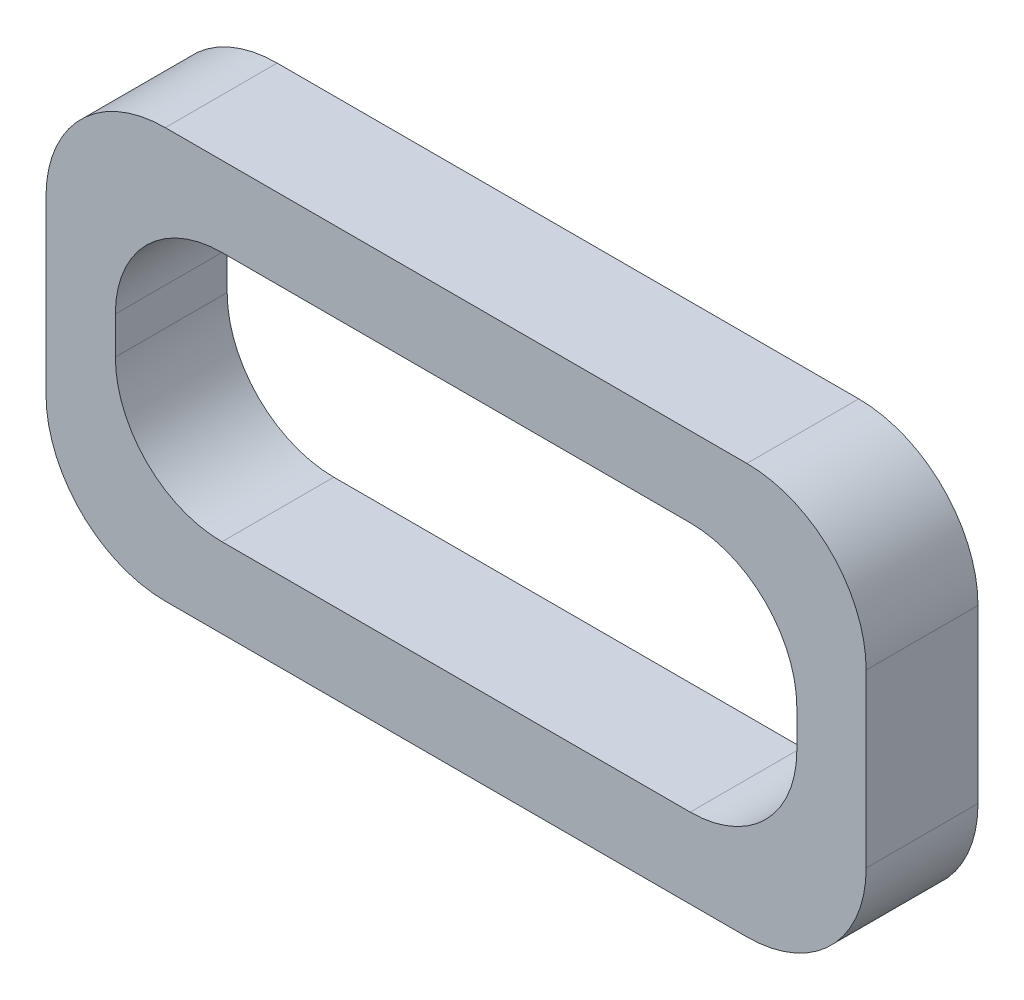
ISO-10303-21;
HEADER;
FILE_DESCRIPTION(('STEP AP214'),'2;1');
FILE_NAME('part.step','',(''),(''),'','','');
FILE_SCHEMA(('AUTOMOTIVE_DESIGN { 1 0 10303 214 1 1 1 1 }'));
ENDSEC;
DATA;
#1=APPLICATION_CONTEXT('core data for automotive mechanical design processes');
#2=APPLICATION_PROTOCOL_DEFINITION('international standard','automotive_design',2000,#1);
#3=PRODUCT_CONTEXT('',#1,'mechanical');
#4=PRODUCT('Part','Part','',(#3));
#5=PRODUCT_RELATED_PRODUCT_CATEGORY('part','',(#4));
#6=PRODUCT_DEFINITION_FORMATION('','',#4);
#7=PRODUCT_DEFINITION_CONTEXT('part definition',#1,'design');
#8=PRODUCT_DEFINITION('design','',#6,#7);
#9=PRODUCT_DEFINITION_SHAPE('','',#8);
#10=(LENGTH_UNIT() NAMED_UNIT(*) SI_UNIT(.MILLI.,.METRE.));
#11=(NAMED_UNIT(*) PLANE_ANGLE_UNIT() SI_UNIT($,.RADIAN.));
#12=(NAMED_UNIT(*) SI_UNIT($,.STERADIAN.) SOLID_ANGLE_UNIT());
#13=UNCERTAINTY_MEASURE_WITH_UNIT(LENGTH_MEASURE(1.E-05),#10,'distance_accuracy_value','');
#14=(GEOMETRIC_REPRESENTATION_CONTEXT(3) GLOBAL_UNCERTAINTY_ASSIGNED_CONTEXT((#13)) GLOBAL_UNIT_ASSIGNED_CONTEXT((#10,
#11,#12)) REPRESENTATION_CONTEXT('',''));
#15=CARTESIAN_POINT('',(0.,0.,0.));
#16=DIRECTION('',(0.,0.,1.));
#17=DIRECTION('',(1.,0.,0.));
#18=AXIS2_PLACEMENT_3D('',#15,#16,#17);
#19=CARTESIAN_POINT('',(-3.9,-1.15,1.5));
#20=DIRECTION('',(0.,0.,1.));
#21=DIRECTION('',(1.,0.,0.));
#22=AXIS2_PLACEMENT_3D('',#19,#20,#21);
#23=PLANE('',#22);
#24=CARTESIAN_POINT('',(-3.9,-1.15,1.5));
#25=DIRECTION('',(0.,0.,1.));
#26=DIRECTION('',(1.,0.,0.));
#27=AXIS2_PLACEMENT_3D('',#24,#25,#26);
#28=CIRCLE('',#27,1.6);
#29=CARTESIAN_POINT('',(-5.5,-1.15,1.5));
#30=VERTEX_POINT('',#29);
#31=CARTESIAN_POINT('',(-3.9,-2.75,1.5));
#32=VERTEX_POINT('',#31);
#33=EDGE_CURVE('E217',#30,#32,#28,.T.);
#34=ORIENTED_EDGE('',*,*,#33,.T.);
#35=DIRECTION('',(1.,0.,0.));
#36=VECTOR('',#35,1.);
#37=CARTESIAN_POINT('',(-3.9,-2.75,1.5));
#38=LINE('',#37,#36);
#39=CARTESIAN_POINT('',(3.9,-2.75,1.5));
#40=VERTEX_POINT('',#39);
#41=EDGE_CURVE('E220',#32,#40,#38,.T.);
#42=ORIENTED_EDGE('',*,*,#41,.T.);
#43=CARTESIAN_POINT('',(3.9,-1.15,1.5));
#44=DIRECTION('',(0.,0.,1.));
#45=DIRECTION('',(1.,0.,0.));
#46=AXIS2_PLACEMENT_3D('',#43,#44,#45);
#47=CIRCLE('',#46,1.6);
#48=CARTESIAN_POINT('',(5.5,-1.15,1.5));
#49=VERTEX_POINT('',#48);
#50=EDGE_CURVE('E223',#40,#49,#47,.T.);
#51=ORIENTED_EDGE('',*,*,#50,.T.);
#52=DIRECTION('',(0.,1.,0.));
#53=VECTOR('',#52,1.);
#54=CARTESIAN_POINT('',(5.5,-1.15,1.5));
#55=LINE('',#54,#53);
#56=CARTESIAN_POINT('',(5.5,1.15,1.5));
#57=VERTEX_POINT('',#56);
#58=EDGE_CURVE('E225',#49,#57,#55,.T.);
#59=ORIENTED_EDGE('',*,*,#58,.T.);
#60=CARTESIAN_POINT('',(3.9,1.15,1.5));
#61=DIRECTION('',(0.,0.,1.));
#62=DIRECTION('',(1.,0.,0.));
#63=AXIS2_PLACEMENT_3D('',#60,#61,#62);
#64=CIRCLE('',#63,1.6);
#65=CARTESIAN_POINT('',(3.9,2.75,1.5));
#66=VERTEX_POINT('',#65);
#67=EDGE_CURVE('E227',#57,#66,#64,.T.);
#68=ORIENTED_EDGE('',*,*,#67,.T.);
#69=DIRECTION('',(-1.,0.,0.));
#70=VECTOR('',#69,1.);
#71=CARTESIAN_POINT('',(3.9,2.75,1.5));
#72=LINE('',#71,#70);
#73=CARTESIAN_POINT('',(-3.9,2.75,1.5));
#74=VERTEX_POINT('',#73);
#75=EDGE_CURVE('E229',#66,#74,#72,.T.);
#76=ORIENTED_EDGE('',*,*,#75,.T.);
#77=CARTESIAN_POINT('',(-3.9,1.15,1.5));
#78=DIRECTION('',(0.,0.,1.));
#79=DIRECTION('',(1.,0.,0.));
#80=AXIS2_PLACEMENT_3D('',#77,#78,#79);
#81=CIRCLE('',#80,1.6);
#82=CARTESIAN_POINT('',(-5.5,1.15,1.5));
#83=VERTEX_POINT('',#82);
#84=EDGE_CURVE('E231',#74,#83,#81,.T.);
#85=ORIENTED_EDGE('',*,*,#84,.T.);
#86=DIRECTION('',(0.,-1.,0.));
#87=VECTOR('',#86,1.);
#88=CARTESIAN_POINT('',(-5.5,1.15,1.5));
#89=LINE('',#88,#87);
#90=EDGE_CURVE('E233',#83,#30,#89,.T.);
#91=ORIENTED_EDGE('',*,*,#90,.T.);
#92=EDGE_LOOP('',(#34,#42,#51,#59,#68,#76,#85,#91));
#93=FACE_BOUND('',#92,.T.);
#94=DIRECTION('',(0.,1.,0.));
#95=VECTOR('',#94,1.);
#96=CARTESIAN_POINT('',(4.57,-0.250000000000001,1.5));
#97=LINE('',#96,#95);
#98=CARTESIAN_POINT('',(4.57,-0.250000000000001,1.5));
#99=VERTEX_POINT('',#98);
#100=CARTESIAN_POINT('',(4.57,0.250000000000001,1.5));
#101=VERTEX_POINT('',#100);
#102=EDGE_CURVE('E160',#99,#101,#97,.T.);
#103=ORIENTED_EDGE('',*,*,#102,.F.);
#104=CARTESIAN_POINT('',(3.14,-0.250000000000001,1.5));
#105=DIRECTION('',(0.,0.,1.));
#106=DIRECTION('',(1.,0.,0.));
#107=AXIS2_PLACEMENT_3D('',#104,#105,#106);
#108=CIRCLE('',#107,1.43);
#109=CARTESIAN_POINT('',(3.14,-1.68,1.5));
#110=VERTEX_POINT('',#109);
#111=EDGE_CURVE('E152',#110,#99,#108,.T.);
#112=ORIENTED_EDGE('',*,*,#111,.F.);
#113=DIRECTION('',(1.,0.,0.));
#114=VECTOR('',#113,1.);
#115=CARTESIAN_POINT('',(-3.14,-1.68,1.5));
#116=LINE('',#115,#114);
#117=CARTESIAN_POINT('',(-3.14,-1.68,1.5));
#118=VERTEX_POINT('',#117);
#119=EDGE_CURVE('E185',#118,#110,#116,.T.);
#120=ORIENTED_EDGE('',*,*,#119,.F.);
#121=CARTESIAN_POINT('',(-3.14,-0.25,1.5));
#122=DIRECTION('',(0.,0.,1.));
#123=DIRECTION('',(1.,0.,0.));
#124=AXIS2_PLACEMENT_3D('',#121,#122,#123);
#125=CIRCLE('',#124,1.43);
#126=CARTESIAN_POINT('',(-4.57,-0.249999999999996,1.5));
#127=VERTEX_POINT('',#126);
#128=EDGE_CURVE('E183',#127,#118,#125,.T.);
#129=ORIENTED_EDGE('',*,*,#128,.F.);
#130=DIRECTION('',(0.,-1.,0.));
#131=VECTOR('',#130,1.);
#132=CARTESIAN_POINT('',(-4.57,0.250000000000004,1.5));
#133=LINE('',#132,#131);
#134=CARTESIAN_POINT('',(-4.57,0.250000000000004,1.5));
#135=VERTEX_POINT('',#134);
#136=EDGE_CURVE('E181',#135,#127,#133,.T.);
#137=ORIENTED_EDGE('',*,*,#136,.F.);
#138=CARTESIAN_POINT('',(-3.14,0.250000000000001,1.5));
#139=DIRECTION('',(0.,0.,1.));
#140=DIRECTION('',(1.,0.,0.));
#141=AXIS2_PLACEMENT_3D('',#138,#139,#140);
#142=CIRCLE('',#141,1.43);
#143=CARTESIAN_POINT('',(-3.14,1.68,1.5));
#144=VERTEX_POINT('',#143);
#145=EDGE_CURVE('E179',#144,#135,#142,.T.);
#146=ORIENTED_EDGE('',*,*,#145,.F.);
#147=DIRECTION('',(-1.,0.,0.));
#148=VECTOR('',#147,1.);
#149=CARTESIAN_POINT('',(3.14,1.68,1.5));
#150=LINE('',#149,#148);
#151=CARTESIAN_POINT('',(3.14,1.68,1.5));
#152=VERTEX_POINT('',#151);
#153=EDGE_CURVE('E175',#152,#144,#150,.T.);
#154=ORIENTED_EDGE('',*,*,#153,.F.);
#155=CARTESIAN_POINT('',(3.14,0.25,1.5));
#156=DIRECTION('',(0.,0.,1.));
#157=DIRECTION('',(1.,0.,0.));
#158=AXIS2_PLACEMENT_3D('',#155,#156,#157);
#159=CIRCLE('',#158,1.43);
#160=EDGE_CURVE('E173',#101,#152,#159,.T.);
#161=ORIENTED_EDGE('',*,*,#160,.F.);
#162=EDGE_LOOP('',(#103,#112,#120,#129,#137,#146,#154,#161));
#163=FACE_BOUND('',#162,.T.);
#164=ADVANCED_FACE('F39',(#93,#163),#23,.T.);
#165=CARTESIAN_POINT('',(-3.9,-1.15,0.));
#166=DIRECTION('',(0.,0.,1.));
#167=DIRECTION('',(1.,0.,0.));
#168=AXIS2_PLACEMENT_3D('',#165,#166,#167);
#169=PLANE('',#168);
#170=CARTESIAN_POINT('',(-3.9,-1.15,0.));
#171=DIRECTION('',(0.,0.,1.));
#172=DIRECTION('',(1.,0.,0.));
#173=AXIS2_PLACEMENT_3D('',#170,#171,#172);
#174=CIRCLE('',#173,1.6);
#175=CARTESIAN_POINT('',(-5.5,-1.15,0.));
#176=VERTEX_POINT('',#175);
#177=CARTESIAN_POINT('',(-3.9,-2.75,0.));
#178=VERTEX_POINT('',#177);
#179=EDGE_CURVE('E168',#176,#178,#174,.T.);
#180=ORIENTED_EDGE('',*,*,#179,.F.);
#181=DIRECTION('',(0.,-1.,0.));
#182=VECTOR('',#181,1.);
#183=CARTESIAN_POINT('',(-5.5,1.15,0.));
#184=LINE('',#183,#182);
#185=CARTESIAN_POINT('',(-5.5,1.15,0.));
#186=VERTEX_POINT('',#185);
#187=EDGE_CURVE('E221',#186,#176,#184,.T.);
#188=ORIENTED_EDGE('',*,*,#187,.F.);
#189=CARTESIAN_POINT('',(-3.9,1.15,0.));
#190=DIRECTION('',(0.,0.,1.));
#191=DIRECTION('',(1.,0.,0.));
#192=AXIS2_PLACEMENT_3D('',#189,#190,#191);
#193=CIRCLE('',#192,1.6);
#194=CARTESIAN_POINT('',(-3.9,2.75,0.));
#195=VERTEX_POINT('',#194);
#196=EDGE_CURVE('E248',#195,#186,#193,.T.);
#197=ORIENTED_EDGE('',*,*,#196,.F.);
#198=DIRECTION('',(-1.,0.,0.));
#199=VECTOR('',#198,1.);
#200=CARTESIAN_POINT('',(3.9,2.75,0.));
#201=LINE('',#200,#199);
#202=CARTESIAN_POINT('',(3.9,2.75,0.));
#203=VERTEX_POINT('',#202);
#204=EDGE_CURVE('E246',#203,#195,#201,.T.);
#205=ORIENTED_EDGE('',*,*,#204,.F.);
#206=CARTESIAN_POINT('',(3.9,1.15,0.));
#207=DIRECTION('',(0.,0.,1.));
#208=DIRECTION('',(1.,0.,0.));
#209=AXIS2_PLACEMENT_3D('',#206,#207,#208);
#210=CIRCLE('',#209,1.6);
#211=CARTESIAN_POINT('',(5.5,1.15,0.));
#212=VERTEX_POINT('',#211);
#213=EDGE_CURVE('E244',#212,#203,#210,.T.);
#214=ORIENTED_EDGE('',*,*,#213,.F.);
#215=DIRECTION('',(0.,1.,0.));
#216=VECTOR('',#215,1.);
#217=CARTESIAN_POINT('',(5.5,-1.15,0.));
#218=LINE('',#217,#216);
#219=CARTESIAN_POINT('',(5.5,-1.15,0.));
#220=VERTEX_POINT('',#219);
#221=EDGE_CURVE('E242',#220,#212,#218,.T.);
#222=ORIENTED_EDGE('',*,*,#221,.F.);
#223=CARTESIAN_POINT('',(3.9,-1.15,0.));
#224=DIRECTION('',(0.,0.,1.));
#225=DIRECTION('',(1.,0.,0.));
#226=AXIS2_PLACEMENT_3D('',#223,#224,#225);
#227=CIRCLE('',#226,1.6);
#228=CARTESIAN_POINT('',(3.9,-2.75,0.));
#229=VERTEX_POINT('',#228);
#230=EDGE_CURVE('E240',#229,#220,#227,.T.);
#231=ORIENTED_EDGE('',*,*,#230,.F.);
#232=DIRECTION('',(1.,0.,0.));
#233=VECTOR('',#232,1.);
#234=CARTESIAN_POINT('',(-3.9,-2.75,0.));
#235=LINE('',#234,#233);
#236=EDGE_CURVE('E238',#178,#229,#235,.T.);
#237=ORIENTED_EDGE('',*,*,#236,.F.);
#238=EDGE_LOOP('',(#180,#188,#197,#205,#214,#222,#231,#237));
#239=FACE_BOUND('',#238,.T.);
#240=CARTESIAN_POINT('',(3.14,-0.250000000000001,0.));
#241=DIRECTION('',(0.,0.,1.));
#242=DIRECTION('',(1.,0.,0.));
#243=AXIS2_PLACEMENT_3D('',#240,#241,#242);
#244=CIRCLE('',#243,1.43);
#245=CARTESIAN_POINT('',(3.14,-1.68,0.));
#246=VERTEX_POINT('',#245);
#247=CARTESIAN_POINT('',(4.57,-0.250000000000001,0.));
#248=VERTEX_POINT('',#247);
#249=EDGE_CURVE('E62',#246,#248,#244,.T.);
#250=ORIENTED_EDGE('',*,*,#249,.T.);
#251=DIRECTION('',(0.,1.,0.));
#252=VECTOR('',#251,1.);
#253=CARTESIAN_POINT('',(4.57,-0.250000000000001,0.));
#254=LINE('',#253,#252);
#255=CARTESIAN_POINT('',(4.57,0.250000000000001,0.));
#256=VERTEX_POINT('',#255);
#257=EDGE_CURVE('E167',#248,#256,#254,.T.);
#258=ORIENTED_EDGE('',*,*,#257,.T.);
#259=CARTESIAN_POINT('',(3.14,0.25,0.));
#260=DIRECTION('',(0.,0.,1.));
#261=DIRECTION('',(1.,0.,0.));
#262=AXIS2_PLACEMENT_3D('',#259,#260,#261);
#263=CIRCLE('',#262,1.43);
#264=CARTESIAN_POINT('',(3.14,1.68,0.));
#265=VERTEX_POINT('',#264);
#266=EDGE_CURVE('E189',#256,#265,#263,.T.);
#267=ORIENTED_EDGE('',*,*,#266,.T.);
#268=DIRECTION('',(-1.,0.,0.));
#269=VECTOR('',#268,1.);
#270=CARTESIAN_POINT('',(3.14,1.68,0.));
#271=LINE('',#270,#269);
#272=CARTESIAN_POINT('',(-3.14,1.68,0.));
#273=VERTEX_POINT('',#272);
#274=EDGE_CURVE('E192',#265,#273,#271,.T.);
#275=ORIENTED_EDGE('',*,*,#274,.T.);
#276=CARTESIAN_POINT('',(-3.14,0.250000000000001,0.));
#277=DIRECTION('',(0.,0.,1.));
#278=DIRECTION('',(1.,0.,0.));
#279=AXIS2_PLACEMENT_3D('',#276,#277,#278);
#280=CIRCLE('',#279,1.43);
#281=CARTESIAN_POINT('',(-4.57,0.250000000000004,0.));
#282=VERTEX_POINT('',#281);
#283=EDGE_CURVE('E195',#273,#282,#280,.T.);
#284=ORIENTED_EDGE('',*,*,#283,.T.);
#285=DIRECTION('',(0.,-1.,0.));
#286=VECTOR('',#285,1.);
#287=CARTESIAN_POINT('',(-4.57,0.250000000000004,0.));
#288=LINE('',#287,#286);
#289=CARTESIAN_POINT('',(-4.57,-0.249999999999996,0.));
#290=VERTEX_POINT('',#289);
#291=EDGE_CURVE('E198',#282,#290,#288,.T.);
#292=ORIENTED_EDGE('',*,*,#291,.T.);
#293=CARTESIAN_POINT('',(-3.14,-0.25,0.));
#294=DIRECTION('',(0.,0.,1.));
#295=DIRECTION('',(1.,0.,0.));
#296=AXIS2_PLACEMENT_3D('',#293,#294,#295);
#297=CIRCLE('',#296,1.43);
#298=CARTESIAN_POINT('',(-3.14,-1.68,0.));
#299=VERTEX_POINT('',#298);
#300=EDGE_CURVE('E201',#290,#299,#297,.T.);
#301=ORIENTED_EDGE('',*,*,#300,.T.);
#302=DIRECTION('',(1.,0.,0.));
#303=VECTOR('',#302,1.);
#304=CARTESIAN_POINT('',(-3.14,-1.68,0.));
#305=LINE('',#304,#303);
#306=EDGE_CURVE('E161',#299,#246,#305,.T.);
#307=ORIENTED_EDGE('',*,*,#306,.T.);
#308=EDGE_LOOP('',(#250,#258,#267,#275,#284,#292,#301,#307));
#309=FACE_BOUND('',#308,.T.);
#310=ADVANCED_FACE('F278',(#239,#309),#169,.F.);
#311=CARTESIAN_POINT('',(-3.9,-1.15,1.5));
#312=DIRECTION('',(0.,0.,-1.));
#313=DIRECTION('',(-1.,0.,0.));
#314=AXIS2_PLACEMENT_3D('',#311,#312,#313);
#315=CYLINDRICAL_SURFACE('',#314,1.6);
#316=ORIENTED_EDGE('',*,*,#179,.T.);
#317=DIRECTION('',(0.,0.,-1.));
#318=VECTOR('',#317,1.);
#319=CARTESIAN_POINT('',(-3.9,-2.75,1.5));
#320=LINE('',#319,#318);
#321=EDGE_CURVE('E11',#32,#178,#320,.T.);
#322=ORIENTED_EDGE('',*,*,#321,.F.);
#323=ORIENTED_EDGE('',*,*,#33,.F.);
#324=DIRECTION('',(0.,0.,-1.));
#325=VECTOR('',#324,1.);
#326=CARTESIAN_POINT('',(-5.5,-1.15,1.5));
#327=LINE('',#326,#325);
#328=EDGE_CURVE('E235',#30,#176,#327,.T.);
#329=ORIENTED_EDGE('',*,*,#328,.T.);
#330=EDGE_LOOP('',(#316,#322,#323,#329));
#331=FACE_BOUND('',#330,.T.);
#332=ADVANCED_FACE('F41',(#331),#315,.T.);
#333=CARTESIAN_POINT('',(-3.9,-2.75,1.5));
#334=DIRECTION('',(0.,1.,0.));
#335=DIRECTION('',(0.,0.,1.));
#336=AXIS2_PLACEMENT_3D('',#333,#334,#335);
#337=PLANE('',#336);
#338=ORIENTED_EDGE('',*,*,#236,.T.);
#339=DIRECTION('',(0.,0.,-1.));
#340=VECTOR('',#339,1.);
#341=CARTESIAN_POINT('',(3.9,-2.75,1.5));
#342=LINE('',#341,#340);
#343=EDGE_CURVE('E47',#40,#229,#342,.T.);
#344=ORIENTED_EDGE('',*,*,#343,.F.);
#345=ORIENTED_EDGE('',*,*,#41,.F.);
#346=ORIENTED_EDGE('',*,*,#321,.T.);
#347=EDGE_LOOP('',(#338,#344,#345,#346));
#348=FACE_BOUND('',#347,.T.);
#349=ADVANCED_FACE('F295',(#348),#337,.F.);
#350=CARTESIAN_POINT('',(3.9,-1.15,1.5));
#351=DIRECTION('',(0.,0.,-1.));
#352=DIRECTION('',(-1.,0.,0.));
#353=AXIS2_PLACEMENT_3D('',#350,#351,#352);
#354=CYLINDRICAL_SURFACE('',#353,1.6);
#355=ORIENTED_EDGE('',*,*,#230,.T.);
#356=DIRECTION('',(0.,0.,-1.));
#357=VECTOR('',#356,1.);
#358=CARTESIAN_POINT('',(5.5,-1.15,1.5));
#359=LINE('',#358,#357);
#360=EDGE_CURVE('E265',#49,#220,#359,.T.);
#361=ORIENTED_EDGE('',*,*,#360,.F.);
#362=ORIENTED_EDGE('',*,*,#50,.F.);
#363=ORIENTED_EDGE('',*,*,#343,.T.);
#364=EDGE_LOOP('',(#355,#361,#362,#363));
#365=FACE_BOUND('',#364,.T.);
#366=ADVANCED_FACE('F272',(#365),#354,.T.);
#367=CARTESIAN_POINT('',(5.5,-1.15,1.5));
#368=DIRECTION('',(-1.,0.,0.));
#369=DIRECTION('',(0.,0.,1.));
#370=AXIS2_PLACEMENT_3D('',#367,#368,#369);
#371=PLANE('',#370);
#372=ORIENTED_EDGE('',*,*,#221,.T.);
#373=DIRECTION('',(0.,0.,-1.));
#374=VECTOR('',#373,1.);
#375=CARTESIAN_POINT('',(5.5,1.15,1.5));
#376=LINE('',#375,#374);
#377=EDGE_CURVE('E262',#57,#212,#376,.T.);
#378=ORIENTED_EDGE('',*,*,#377,.F.);
#379=ORIENTED_EDGE('',*,*,#58,.F.);
#380=ORIENTED_EDGE('',*,*,#360,.T.);
#381=EDGE_LOOP('',(#372,#378,#379,#380));
#382=FACE_BOUND('',#381,.T.);
#383=ADVANCED_FACE('F284',(#382),#371,.F.);
#384=CARTESIAN_POINT('',(3.9,1.15,1.5));
#385=DIRECTION('',(0.,0.,-1.));
#386=DIRECTION('',(-1.,0.,0.));
#387=AXIS2_PLACEMENT_3D('',#384,#385,#386);
#388=CYLINDRICAL_SURFACE('',#387,1.6);
#389=ORIENTED_EDGE('',*,*,#213,.T.);
#390=DIRECTION('',(0.,0.,-1.));
#391=VECTOR('',#390,1.);
#392=CARTESIAN_POINT('',(3.9,2.75,1.5));
#393=LINE('',#392,#391);
#394=EDGE_CURVE('E259',#66,#203,#393,.T.);
#395=ORIENTED_EDGE('',*,*,#394,.F.);
#396=ORIENTED_EDGE('',*,*,#67,.F.);
#397=ORIENTED_EDGE('',*,*,#377,.T.);
#398=EDGE_LOOP('',(#389,#395,#396,#397));
#399=FACE_BOUND('',#398,.T.);
#400=ADVANCED_FACE('F288',(#399),#388,.T.);
#401=CARTESIAN_POINT('',(3.9,2.75,1.5));
#402=DIRECTION('',(0.,-1.,0.));
#403=DIRECTION('',(1.,0.,0.));
#404=AXIS2_PLACEMENT_3D('',#401,#402,#403);
#405=PLANE('',#404);
#406=ORIENTED_EDGE('',*,*,#204,.T.);
#407=DIRECTION('',(0.,0.,-1.));
#408=VECTOR('',#407,1.);
#409=CARTESIAN_POINT('',(-3.9,2.75,1.5));
#410=LINE('',#409,#408);
#411=EDGE_CURVE('E256',#74,#195,#410,.T.);
#412=ORIENTED_EDGE('',*,*,#411,.F.);
#413=ORIENTED_EDGE('',*,*,#75,.F.);
#414=ORIENTED_EDGE('',*,*,#394,.T.);
#415=EDGE_LOOP('',(#406,#412,#413,#414));
#416=FACE_BOUND('',#415,.T.);
#417=ADVANCED_FACE('F308',(#416),#405,.F.);
#418=CARTESIAN_POINT('',(-3.9,1.15,1.5));
#419=DIRECTION('',(0.,0.,-1.));
#420=DIRECTION('',(-1.,0.,0.));
#421=AXIS2_PLACEMENT_3D('',#418,#419,#420);
#422=CYLINDRICAL_SURFACE('',#421,1.6);
#423=ORIENTED_EDGE('',*,*,#196,.T.);
#424=DIRECTION('',(0.,0.,-1.));
#425=VECTOR('',#424,1.);
#426=CARTESIAN_POINT('',(-5.5,1.15,1.5));
#427=LINE('',#426,#425);
#428=EDGE_CURVE('E253',#83,#186,#427,.T.);
#429=ORIENTED_EDGE('',*,*,#428,.F.);
#430=ORIENTED_EDGE('',*,*,#84,.F.);
#431=ORIENTED_EDGE('',*,*,#411,.T.);
#432=EDGE_LOOP('',(#423,#429,#430,#431));
#433=FACE_BOUND('',#432,.T.);
#434=ADVANCED_FACE('F306',(#433),#422,.T.);
#435=CARTESIAN_POINT('',(-5.5,1.15,1.5));
#436=DIRECTION('',(1.,0.,0.));
#437=DIRECTION('',(0.,1.,0.));
#438=AXIS2_PLACEMENT_3D('',#435,#436,#437);
#439=PLANE('',#438);
#440=ORIENTED_EDGE('',*,*,#187,.T.);
#441=ORIENTED_EDGE('',*,*,#328,.F.);
#442=ORIENTED_EDGE('',*,*,#90,.F.);
#443=ORIENTED_EDGE('',*,*,#428,.T.);
#444=EDGE_LOOP('',(#440,#441,#442,#443));
#445=FACE_BOUND('',#444,.T.);
#446=ADVANCED_FACE('F301',(#445),#439,.F.);
#447=CARTESIAN_POINT('',(3.14,-0.250000000000001,1.5));
#448=DIRECTION('',(0.,0.,-1.));
#449=DIRECTION('',(-1.,0.,0.));
#450=AXIS2_PLACEMENT_3D('',#447,#448,#449);
#451=CYLINDRICAL_SURFACE('',#450,1.43);
#452=ORIENTED_EDGE('',*,*,#249,.F.);
#453=DIRECTION('',(0.,0.,-1.));
#454=VECTOR('',#453,1.);
#455=CARTESIAN_POINT('',(3.14,-1.68,1.5));
#456=LINE('',#455,#454);
#457=EDGE_CURVE('E156',#110,#246,#456,.T.);
#458=ORIENTED_EDGE('',*,*,#457,.F.);
#459=ORIENTED_EDGE('',*,*,#111,.T.);
#460=DIRECTION('',(0.,0.,-1.));
#461=VECTOR('',#460,1.);
#462=CARTESIAN_POINT('',(4.57,-0.250000000000001,1.5));
#463=LINE('',#462,#461);
#464=EDGE_CURVE('E155',#99,#248,#463,.T.);
#465=ORIENTED_EDGE('',*,*,#464,.T.);
#466=EDGE_LOOP('',(#452,#458,#459,#465));
#467=FACE_BOUND('',#466,.T.);
#468=ADVANCED_FACE('F154',(#467),#451,.F.);
#469=CARTESIAN_POINT('',(4.57,-0.250000000000001,1.5));
#470=DIRECTION('',(-1.,0.,0.));
#471=DIRECTION('',(0.,0.,1.));
#472=AXIS2_PLACEMENT_3D('',#469,#470,#471);
#473=PLANE('',#472);
#474=ORIENTED_EDGE('',*,*,#257,.F.);
#475=ORIENTED_EDGE('',*,*,#464,.F.);
#476=ORIENTED_EDGE('',*,*,#102,.T.);
#477=DIRECTION('',(0.,0.,-1.));
#478=VECTOR('',#477,1.);
#479=CARTESIAN_POINT('',(4.57,0.250000000000001,1.5));
#480=LINE('',#479,#478);
#481=EDGE_CURVE('E169',#101,#256,#480,.T.);
#482=ORIENTED_EDGE('',*,*,#481,.T.);
#483=EDGE_LOOP('',(#474,#475,#476,#482));
#484=FACE_BOUND('',#483,.T.);
#485=ADVANCED_FACE('F164',(#484),#473,.T.);
#486=CARTESIAN_POINT('',(3.14,0.25,1.5));
#487=DIRECTION('',(0.,0.,-1.));
#488=DIRECTION('',(-1.,0.,0.));
#489=AXIS2_PLACEMENT_3D('',#486,#487,#488);
#490=CYLINDRICAL_SURFACE('',#489,1.43);
#491=ORIENTED_EDGE('',*,*,#266,.F.);
#492=ORIENTED_EDGE('',*,*,#481,.F.);
#493=ORIENTED_EDGE('',*,*,#160,.T.);
#494=DIRECTION('',(0.,0.,-1.));
#495=VECTOR('',#494,1.);
#496=CARTESIAN_POINT('',(3.14,1.68,1.5));
#497=LINE('',#496,#495);
#498=EDGE_CURVE('E214',#152,#265,#497,.T.);
#499=ORIENTED_EDGE('',*,*,#498,.T.);
#500=EDGE_LOOP('',(#491,#492,#493,#499));
#501=FACE_BOUND('',#500,.T.);
#502=ADVANCED_FACE('F333',(#501),#490,.F.);
#503=CARTESIAN_POINT('',(3.14,1.68,1.5));
#504=DIRECTION('',(0.,-1.,0.));
#505=DIRECTION('',(0.,0.,-1.));
#506=AXIS2_PLACEMENT_3D('',#503,#504,#505);
#507=PLANE('',#506);
#508=ORIENTED_EDGE('',*,*,#274,.F.);
#509=ORIENTED_EDGE('',*,*,#498,.F.);
#510=ORIENTED_EDGE('',*,*,#153,.T.);
#511=DIRECTION('',(0.,0.,-1.));
#512=VECTOR('',#511,1.);
#513=CARTESIAN_POINT('',(-3.14,1.68,1.5));
#514=LINE('',#513,#512);
#515=EDGE_CURVE('E212',#144,#273,#514,.T.);
#516=ORIENTED_EDGE('',*,*,#515,.T.);
#517=EDGE_LOOP('',(#508,#509,#510,#516));
#518=FACE_BOUND('',#517,.T.);
#519=ADVANCED_FACE('F337',(#518),#507,.T.);
#520=CARTESIAN_POINT('',(-3.14,0.250000000000001,1.5));
#521=DIRECTION('',(0.,0.,-1.));
#522=DIRECTION('',(-1.,0.,0.));
#523=AXIS2_PLACEMENT_3D('',#520,#521,#522);
#524=CYLINDRICAL_SURFACE('',#523,1.43);
#525=ORIENTED_EDGE('',*,*,#283,.F.);
#526=ORIENTED_EDGE('',*,*,#515,.F.);
#527=ORIENTED_EDGE('',*,*,#145,.T.);
#528=DIRECTION('',(0.,0.,-1.));
#529=VECTOR('',#528,1.);
#530=CARTESIAN_POINT('',(-4.57,0.250000000000004,1.5));
#531=LINE('',#530,#529);
#532=EDGE_CURVE('E210',#135,#282,#531,.T.);
#533=ORIENTED_EDGE('',*,*,#532,.T.);
#534=EDGE_LOOP('',(#525,#526,#527,#533));
#535=FACE_BOUND('',#534,.T.);
#536=ADVANCED_FACE('F343',(#535),#524,.F.);
#537=CARTESIAN_POINT('',(-4.57,0.250000000000004,1.5));
#538=DIRECTION('',(1.,0.,0.));
#539=DIRECTION('',(0.,1.,0.));
#540=AXIS2_PLACEMENT_3D('',#537,#538,#539);
#541=PLANE('',#540);
#542=ORIENTED_EDGE('',*,*,#291,.F.);
#543=ORIENTED_EDGE('',*,*,#532,.F.);
#544=ORIENTED_EDGE('',*,*,#136,.T.);
#545=DIRECTION('',(0.,0.,-1.));
#546=VECTOR('',#545,1.);
#547=CARTESIAN_POINT('',(-4.57,-0.249999999999996,1.5));
#548=LINE('',#547,#546);
#549=EDGE_CURVE('E208',#127,#290,#548,.T.);
#550=ORIENTED_EDGE('',*,*,#549,.T.);
#551=EDGE_LOOP('',(#542,#543,#544,#550));
#552=FACE_BOUND('',#551,.T.);
#553=ADVANCED_FACE('F347',(#552),#541,.T.);
#554=CARTESIAN_POINT('',(-3.14,-0.25,1.5));
#555=DIRECTION('',(0.,0.,-1.));
#556=DIRECTION('',(-1.,0.,0.));
#557=AXIS2_PLACEMENT_3D('',#554,#555,#556);
#558=CYLINDRICAL_SURFACE('',#557,1.43);
#559=ORIENTED_EDGE('',*,*,#300,.F.);
#560=ORIENTED_EDGE('',*,*,#549,.F.);
#561=ORIENTED_EDGE('',*,*,#128,.T.);
#562=DIRECTION('',(0.,0.,-1.));
#563=VECTOR('',#562,1.);
#564=CARTESIAN_POINT('',(-3.14,-1.68,1.5));
#565=LINE('',#564,#563);
#566=EDGE_CURVE('E54',#118,#299,#565,.T.);
#567=ORIENTED_EDGE('',*,*,#566,.T.);
#568=EDGE_LOOP('',(#559,#560,#561,#567));
#569=FACE_BOUND('',#568,.T.);
#570=ADVANCED_FACE('F351',(#569),#558,.F.);
#571=CARTESIAN_POINT('',(-3.14,-1.68,1.5));
#572=DIRECTION('',(0.,1.,0.));
#573=DIRECTION('',(-1.,0.,0.));
#574=AXIS2_PLACEMENT_3D('',#571,#572,#573);
#575=PLANE('',#574);
#576=ORIENTED_EDGE('',*,*,#306,.F.);
#577=ORIENTED_EDGE('',*,*,#566,.F.);
#578=ORIENTED_EDGE('',*,*,#119,.T.);
#579=ORIENTED_EDGE('',*,*,#457,.T.);
#580=EDGE_LOOP('',(#576,#577,#578,#579));
#581=FACE_BOUND('',#580,.T.);
#582=ADVANCED_FACE('F355',(#581),#575,.T.);
#583=CLOSED_SHELL('',(#164,#310,#332,#349,#366,#383,#400,#417,#434,#446,#468,#485,#502,#519,
#536,#553,#570,#582));
#584=MANIFOLD_SOLID_BREP('B2',#583);
#585=ADVANCED_BREP_SHAPE_REPRESENTATION('',(#18,#584),#14);
#586=SHAPE_DEFINITION_REPRESENTATION(#9,#585);
ENDSEC;
END-ISO-10303-21;
